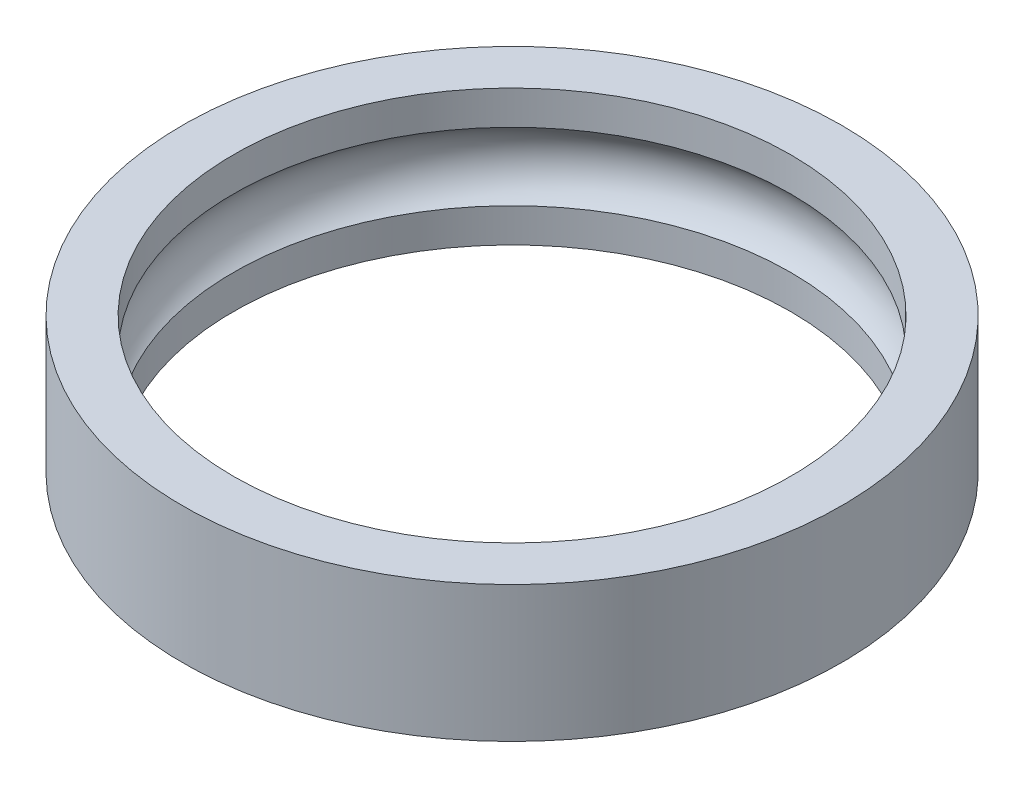
ISO-10303-21;
HEADER;
FILE_DESCRIPTION(('STEP AP214'),'2;1');
FILE_NAME('part.step','',(''),(''),'','','');
FILE_SCHEMA(('AUTOMOTIVE_DESIGN { 1 0 10303 214 1 1 1 1 }'));
ENDSEC;
DATA;
#1=APPLICATION_CONTEXT('core data for automotive mechanical design processes');
#2=APPLICATION_PROTOCOL_DEFINITION('international standard','automotive_design',2000,#1);
#3=PRODUCT_CONTEXT('',#1,'mechanical');
#4=PRODUCT('Part','Part','',(#3));
#5=PRODUCT_RELATED_PRODUCT_CATEGORY('part','',(#4));
#6=PRODUCT_DEFINITION_FORMATION('','',#4);
#7=PRODUCT_DEFINITION_CONTEXT('part definition',#1,'design');
#8=PRODUCT_DEFINITION('design','',#6,#7);
#9=PRODUCT_DEFINITION_SHAPE('','',#8);
#10=(LENGTH_UNIT() NAMED_UNIT(*) SI_UNIT(.MILLI.,.METRE.));
#11=(NAMED_UNIT(*) PLANE_ANGLE_UNIT() SI_UNIT($,.RADIAN.));
#12=(NAMED_UNIT(*) SI_UNIT($,.STERADIAN.) SOLID_ANGLE_UNIT());
#13=UNCERTAINTY_MEASURE_WITH_UNIT(LENGTH_MEASURE(1.E-05),#10,'distance_accuracy_value','');
#14=(GEOMETRIC_REPRESENTATION_CONTEXT(3) GLOBAL_UNCERTAINTY_ASSIGNED_CONTEXT((#13)) GLOBAL_UNIT_ASSIGNED_CONTEXT((#10,
#11,#12)) REPRESENTATION_CONTEXT('',''));
#15=CARTESIAN_POINT('',(0.,0.,0.));
#16=DIRECTION('',(0.,0.,1.));
#17=DIRECTION('',(1.,0.,0.));
#18=AXIS2_PLACEMENT_3D('',#15,#16,#17);
#19=CARTESIAN_POINT('',(0.,6.35,0.));
#20=DIRECTION('',(0.,-1.,0.));
#21=DIRECTION('',(0.,0.,-1.));
#22=AXIS2_PLACEMENT_3D('',#19,#20,#21);
#23=TOROIDAL_SURFACE('',#22,23.65375,3.96875);
#24=CARTESIAN_POINT('',(0.,3.175,0.));
#25=DIRECTION('',(0.,-1.,0.));
#26=DIRECTION('',(0.,0.,-1.));
#27=AXIS2_PLACEMENT_3D('',#24,#25,#26);
#28=CIRCLE('',#27,26.035);
#29=CARTESIAN_POINT('',(0.,3.175,-26.035));
#30=VERTEX_POINT('',#29);
#31=EDGE_CURVE('E62',#30,#30,#28,.T.);
#32=ORIENTED_EDGE('',*,*,#31,.T.);
#33=EDGE_LOOP('',(#32));
#34=FACE_BOUND('',#33,.T.);
#35=CARTESIAN_POINT('',(0.,9.525,0.));
#36=DIRECTION('',(0.,-1.,0.));
#37=DIRECTION('',(0.,0.,-1.));
#38=AXIS2_PLACEMENT_3D('',#35,#36,#37);
#39=CIRCLE('',#38,26.035);
#40=CARTESIAN_POINT('',(0.,9.525,-26.035));
#41=VERTEX_POINT('',#40);
#42=EDGE_CURVE('E10',#41,#41,#39,.T.);
#43=ORIENTED_EDGE('',*,*,#42,.F.);
#44=EDGE_LOOP('',(#43));
#45=FACE_BOUND('',#44,.T.);
#46=ADVANCED_FACE('F34',(#34,#45),#23,.F.);
#47=CARTESIAN_POINT('',(0.,0.,0.));
#48=DIRECTION('',(0.,-1.,0.));
#49=DIRECTION('',(0.,0.,-1.));
#50=AXIS2_PLACEMENT_3D('',#47,#48,#49);
#51=CYLINDRICAL_SURFACE('',#50,26.035);
#52=ORIENTED_EDGE('',*,*,#42,.T.);
#53=EDGE_LOOP('',(#52));
#54=FACE_BOUND('',#53,.T.);
#55=CARTESIAN_POINT('',(0.,12.7,0.));
#56=DIRECTION('',(0.,-1.,0.));
#57=DIRECTION('',(0.,0.,-1.));
#58=AXIS2_PLACEMENT_3D('',#55,#56,#57);
#59=CIRCLE('',#58,26.035);
#60=CARTESIAN_POINT('',(0.,12.7,-26.035));
#61=VERTEX_POINT('',#60);
#62=EDGE_CURVE('E41',#61,#61,#59,.T.);
#63=ORIENTED_EDGE('',*,*,#62,.F.);
#64=EDGE_LOOP('',(#63));
#65=FACE_BOUND('',#64,.T.);
#66=ADVANCED_FACE('F80',(#54,#65),#51,.F.);
#67=CARTESIAN_POINT('',(26.035,12.7,0.));
#68=DIRECTION('',(0.,1.,0.));
#69=DIRECTION('',(0.,0.,1.));
#70=AXIS2_PLACEMENT_3D('',#67,#68,#69);
#71=PLANE('',#70);
#72=ORIENTED_EDGE('',*,*,#62,.T.);
#73=EDGE_LOOP('',(#72));
#74=FACE_BOUND('',#73,.T.);
#75=CARTESIAN_POINT('',(0.,12.7,0.));
#76=DIRECTION('',(0.,-1.,0.));
#77=DIRECTION('',(0.,0.,-1.));
#78=AXIS2_PLACEMENT_3D('',#75,#76,#77);
#79=CIRCLE('',#78,30.7975);
#80=CARTESIAN_POINT('',(0.,12.7,-30.7975));
#81=VERTEX_POINT('',#80);
#82=EDGE_CURVE('E47',#81,#81,#79,.T.);
#83=ORIENTED_EDGE('',*,*,#82,.F.);
#84=EDGE_LOOP('',(#83));
#85=FACE_BOUND('',#84,.T.);
#86=ADVANCED_FACE('F84',(#74,#85),#71,.T.);
#87=CARTESIAN_POINT('',(0.,0.,0.));
#88=DIRECTION('',(0.,-1.,0.));
#89=DIRECTION('',(0.,0.,-1.));
#90=AXIS2_PLACEMENT_3D('',#87,#88,#89);
#91=CYLINDRICAL_SURFACE('',#90,30.7975);
#92=ORIENTED_EDGE('',*,*,#82,.T.);
#93=EDGE_LOOP('',(#92));
#94=FACE_BOUND('',#93,.T.);
#95=CARTESIAN_POINT('',(0.,0.,0.));
#96=DIRECTION('',(0.,-1.,0.));
#97=DIRECTION('',(0.,0.,-1.));
#98=AXIS2_PLACEMENT_3D('',#95,#96,#97);
#99=CIRCLE('',#98,30.7975);
#100=CARTESIAN_POINT('',(0.,0.,-30.7975));
#101=VERTEX_POINT('',#100);
#102=EDGE_CURVE('E52',#101,#101,#99,.T.);
#103=ORIENTED_EDGE('',*,*,#102,.F.);
#104=EDGE_LOOP('',(#103));
#105=FACE_BOUND('',#104,.T.);
#106=ADVANCED_FACE('F76',(#94,#105),#91,.T.);
#107=CARTESIAN_POINT('',(26.035,0.,0.));
#108=DIRECTION('',(0.,-1.,0.));
#109=DIRECTION('',(0.,0.,-1.));
#110=AXIS2_PLACEMENT_3D('',#107,#108,#109);
#111=PLANE('',#110);
#112=ORIENTED_EDGE('',*,*,#102,.T.);
#113=EDGE_LOOP('',(#112));
#114=FACE_BOUND('',#113,.T.);
#115=CARTESIAN_POINT('',(0.,0.,0.));
#116=DIRECTION('',(0.,-1.,0.));
#117=DIRECTION('',(0.,0.,-1.));
#118=AXIS2_PLACEMENT_3D('',#115,#116,#117);
#119=CIRCLE('',#118,26.035);
#120=CARTESIAN_POINT('',(0.,0.,-26.035));
#121=VERTEX_POINT('',#120);
#122=EDGE_CURVE('E58',#121,#121,#119,.T.);
#123=ORIENTED_EDGE('',*,*,#122,.F.);
#124=EDGE_LOOP('',(#123));
#125=FACE_BOUND('',#124,.T.);
#126=ADVANCED_FACE('F70',(#114,#125),#111,.T.);
#127=CARTESIAN_POINT('',(0.,0.,0.));
#128=DIRECTION('',(0.,-1.,0.));
#129=DIRECTION('',(0.,0.,-1.));
#130=AXIS2_PLACEMENT_3D('',#127,#128,#129);
#131=CYLINDRICAL_SURFACE('',#130,26.035);
#132=ORIENTED_EDGE('',*,*,#122,.T.);
#133=EDGE_LOOP('',(#132));
#134=FACE_BOUND('',#133,.T.);
#135=ORIENTED_EDGE('',*,*,#31,.F.);
#136=EDGE_LOOP('',(#135));
#137=FACE_BOUND('',#136,.T.);
#138=ADVANCED_FACE('F68',(#134,#137),#131,.F.);
#139=CLOSED_SHELL('',(#46,#66,#86,#106,#126,#138));
#140=MANIFOLD_SOLID_BREP('B2',#139);
#141=ADVANCED_BREP_SHAPE_REPRESENTATION('',(#18,#140),#14);
#142=SHAPE_DEFINITION_REPRESENTATION(#9,#141);
ENDSEC;
END-ISO-10303-21;
